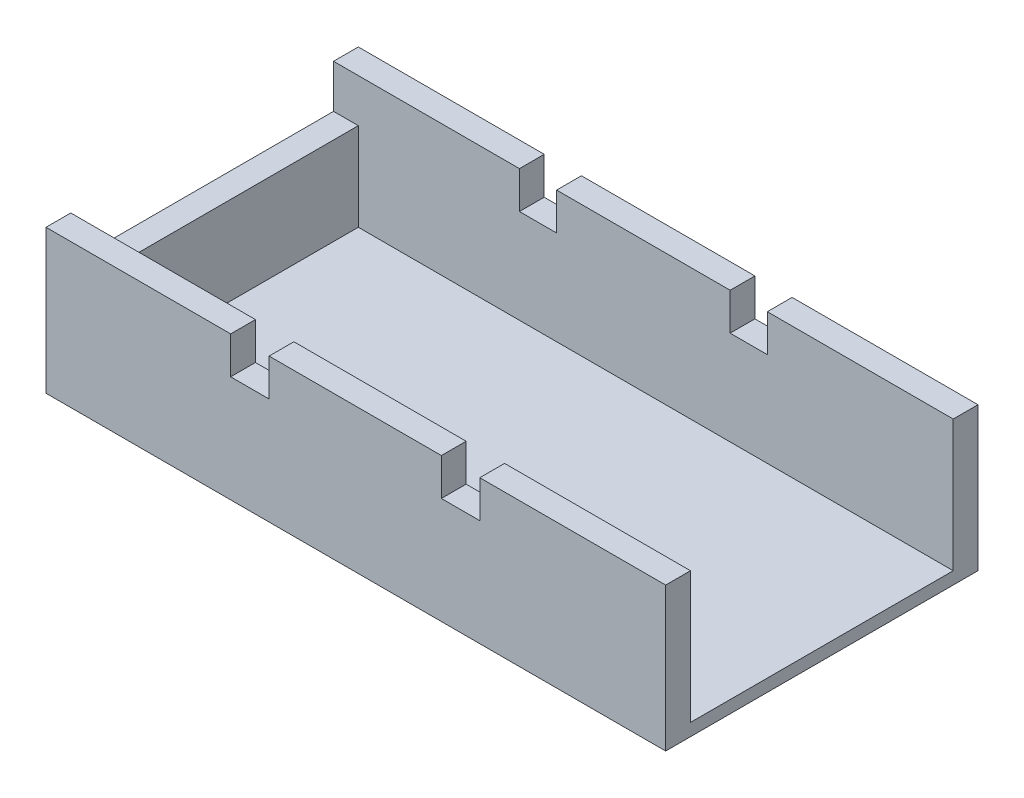
ISO-10303-21;
HEADER;
FILE_DESCRIPTION(('STEP AP214'),'2;1');
FILE_NAME('part.step','',(''),(''),'','','');
FILE_SCHEMA(('AUTOMOTIVE_DESIGN { 1 0 10303 214 1 1 1 1 }'));
ENDSEC;
DATA;
#1=APPLICATION_CONTEXT('core data for automotive mechanical design processes');
#2=APPLICATION_PROTOCOL_DEFINITION('international standard','automotive_design',2000,#1);
#3=PRODUCT_CONTEXT('',#1,'mechanical');
#4=PRODUCT('Part','Part','',(#3));
#5=PRODUCT_RELATED_PRODUCT_CATEGORY('part','',(#4));
#6=PRODUCT_DEFINITION_FORMATION('','',#4);
#7=PRODUCT_DEFINITION_CONTEXT('part definition',#1,'design');
#8=PRODUCT_DEFINITION('design','',#6,#7);
#9=PRODUCT_DEFINITION_SHAPE('','',#8);
#10=(LENGTH_UNIT() NAMED_UNIT(*) SI_UNIT(.MILLI.,.METRE.));
#11=(NAMED_UNIT(*) PLANE_ANGLE_UNIT() SI_UNIT($,.RADIAN.));
#12=(NAMED_UNIT(*) SI_UNIT($,.STERADIAN.) SOLID_ANGLE_UNIT());
#13=UNCERTAINTY_MEASURE_WITH_UNIT(LENGTH_MEASURE(1.E-05),#10,'distance_accuracy_value','');
#14=(GEOMETRIC_REPRESENTATION_CONTEXT(3) GLOBAL_UNCERTAINTY_ASSIGNED_CONTEXT((#13)) GLOBAL_UNIT_ASSIGNED_CONTEXT((#10,
#11,#12)) REPRESENTATION_CONTEXT('',''));
#15=CARTESIAN_POINT('',(0.,0.,0.));
#16=DIRECTION('',(0.,0.,1.));
#17=DIRECTION('',(1.,0.,0.));
#18=AXIS2_PLACEMENT_3D('',#15,#16,#17);
#19=CARTESIAN_POINT('',(-25.,8.6,-10.6));
#20=DIRECTION('',(0.,0.,-1.));
#21=DIRECTION('',(-1.,0.,0.));
#22=AXIS2_PLACEMENT_3D('',#19,#20,#21);
#23=PLANE('',#22);
#24=DIRECTION('',(-1.,0.,0.));
#25=VECTOR('',#24,1.);
#26=CARTESIAN_POINT('',(-23.,8.1,-10.6));
#27=LINE('',#26,#25);
#28=CARTESIAN_POINT('',(-23.,8.1,-10.6));
#29=VERTEX_POINT('',#28);
#30=CARTESIAN_POINT('',(-25.,8.1,-10.6));
#31=VERTEX_POINT('',#30);
#32=EDGE_CURVE('E529',#29,#31,#27,.T.);
#33=ORIENTED_EDGE('',*,*,#32,.F.);
#34=DIRECTION('',(0.,1.,0.));
#35=VECTOR('',#34,1.);
#36=CARTESIAN_POINT('',(-23.,8.6,-10.6));
#37=LINE('',#36,#35);
#38=CARTESIAN_POINT('',(-23.,1.,-10.6));
#39=VERTEX_POINT('',#38);
#40=EDGE_CURVE('E55',#39,#29,#37,.T.);
#41=ORIENTED_EDGE('',*,*,#40,.F.);
#42=DIRECTION('',(1.,0.,0.));
#43=VECTOR('',#42,1.);
#44=CARTESIAN_POINT('',(-25.,1.,-10.6));
#45=LINE('',#44,#43);
#46=CARTESIAN_POINT('',(25.,1.,-10.6));
#47=VERTEX_POINT('',#46);
#48=EDGE_CURVE('E418',#39,#47,#45,.T.);
#49=ORIENTED_EDGE('',*,*,#48,.T.);
#50=DIRECTION('',(0.,-1.,0.));
#51=VECTOR('',#50,1.);
#52=CARTESIAN_POINT('',(25.,8.6,-10.6));
#53=LINE('',#52,#51);
#54=CARTESIAN_POINT('',(25.,11.6,-10.6));
#55=VERTEX_POINT('',#54);
#56=EDGE_CURVE('E427',#55,#47,#53,.T.);
#57=ORIENTED_EDGE('',*,*,#56,.F.);
#58=DIRECTION('',(1.,0.,0.));
#59=VECTOR('',#58,1.);
#60=CARTESIAN_POINT('',(10.,11.6,-10.6));
#61=LINE('',#60,#59);
#62=CARTESIAN_POINT('',(10.,11.6,-10.6));
#63=VERTEX_POINT('',#62);
#64=EDGE_CURVE('E318',#63,#55,#61,.T.);
#65=ORIENTED_EDGE('',*,*,#64,.F.);
#66=DIRECTION('',(0.,-1.,0.));
#67=VECTOR('',#66,1.);
#68=CARTESIAN_POINT('',(10.,11.6,-10.6));
#69=LINE('',#68,#67);
#70=CARTESIAN_POINT('',(10.,8.6,-10.6));
#71=VERTEX_POINT('',#70);
#72=EDGE_CURVE('E326',#63,#71,#69,.T.);
#73=ORIENTED_EDGE('',*,*,#72,.T.);
#74=DIRECTION('',(1.,0.,0.));
#75=VECTOR('',#74,1.);
#76=CARTESIAN_POINT('',(-25.,8.6,-10.6));
#77=LINE('',#76,#75);
#78=CARTESIAN_POINT('',(7.,8.6,-10.6));
#79=VERTEX_POINT('',#78);
#80=EDGE_CURVE('E422',#79,#71,#77,.T.);
#81=ORIENTED_EDGE('',*,*,#80,.F.);
#82=DIRECTION('',(0.,-1.,0.));
#83=VECTOR('',#82,1.);
#84=CARTESIAN_POINT('',(7.,11.6,-10.6));
#85=LINE('',#84,#83);
#86=CARTESIAN_POINT('',(7.,11.6,-10.6));
#87=VERTEX_POINT('',#86);
#88=EDGE_CURVE('E362',#87,#79,#85,.T.);
#89=ORIENTED_EDGE('',*,*,#88,.F.);
#90=DIRECTION('',(1.,0.,0.));
#91=VECTOR('',#90,1.);
#92=CARTESIAN_POINT('',(-7.00000000000001,11.6,-10.6));
#93=LINE('',#92,#91);
#94=CARTESIAN_POINT('',(-7.00000000000001,11.6,-10.6));
#95=VERTEX_POINT('',#94);
#96=EDGE_CURVE('E346',#95,#87,#93,.T.);
#97=ORIENTED_EDGE('',*,*,#96,.F.);
#98=DIRECTION('',(0.,-1.,0.));
#99=VECTOR('',#98,1.);
#100=CARTESIAN_POINT('',(-7.00000000000001,11.6,-10.6));
#101=LINE('',#100,#99);
#102=CARTESIAN_POINT('',(-7.,8.6,-10.6));
#103=VERTEX_POINT('',#102);
#104=EDGE_CURVE('E366',#95,#103,#101,.T.);
#105=ORIENTED_EDGE('',*,*,#104,.T.);
#106=CARTESIAN_POINT('',(-10.,8.6,-10.6));
#107=VERTEX_POINT('',#106);
#108=EDGE_CURVE('E424',#107,#103,#77,.T.);
#109=ORIENTED_EDGE('',*,*,#108,.F.);
#110=DIRECTION('',(0.,-1.,0.));
#111=VECTOR('',#110,1.);
#112=CARTESIAN_POINT('',(-10.,11.6,-10.6));
#113=LINE('',#112,#111);
#114=CARTESIAN_POINT('',(-10.,11.6,-10.6));
#115=VERTEX_POINT('',#114);
#116=EDGE_CURVE('E396',#115,#107,#113,.T.);
#117=ORIENTED_EDGE('',*,*,#116,.F.);
#118=DIRECTION('',(1.,0.,0.));
#119=VECTOR('',#118,1.);
#120=CARTESIAN_POINT('',(-25.,11.6,-10.6));
#121=LINE('',#120,#119);
#122=CARTESIAN_POINT('',(-25.,11.6,-10.6));
#123=VERTEX_POINT('',#122);
#124=EDGE_CURVE('E383',#123,#115,#121,.T.);
#125=ORIENTED_EDGE('',*,*,#124,.F.);
#126=DIRECTION('',(0.,-1.,0.));
#127=VECTOR('',#126,1.);
#128=CARTESIAN_POINT('',(-25.,8.6,-10.6));
#129=LINE('',#128,#127);
#130=EDGE_CURVE('E433',#123,#31,#129,.T.);
#131=ORIENTED_EDGE('',*,*,#130,.T.);
#132=EDGE_LOOP('',(#33,#41,#49,#57,#65,#73,#81,#89,#97,#105,#109,#117,#125,#131));
#133=FACE_BOUND('',#132,.T.);
#134=ADVANCED_FACE('F39',(#133),#23,.F.);
#135=CARTESIAN_POINT('',(25.,8.6,10.6));
#136=DIRECTION('',(0.,0.,1.));
#137=DIRECTION('',(1.,0.,0.));
#138=AXIS2_PLACEMENT_3D('',#135,#136,#137);
#139=PLANE('',#138);
#140=DIRECTION('',(0.,-1.,0.));
#141=VECTOR('',#140,1.);
#142=CARTESIAN_POINT('',(-23.,8.6,10.6));
#143=LINE('',#142,#141);
#144=CARTESIAN_POINT('',(-23.,8.1,10.6));
#145=VERTEX_POINT('',#144);
#146=CARTESIAN_POINT('',(-23.,1.,10.6));
#147=VERTEX_POINT('',#146);
#148=EDGE_CURVE('E11',#145,#147,#143,.T.);
#149=ORIENTED_EDGE('',*,*,#148,.F.);
#150=DIRECTION('',(1.,0.,0.));
#151=VECTOR('',#150,1.);
#152=CARTESIAN_POINT('',(-25.,8.1,10.6));
#153=LINE('',#152,#151);
#154=CARTESIAN_POINT('',(-25.,8.1,10.6));
#155=VERTEX_POINT('',#154);
#156=EDGE_CURVE('E528',#155,#145,#153,.T.);
#157=ORIENTED_EDGE('',*,*,#156,.F.);
#158=DIRECTION('',(0.,-1.,0.));
#159=VECTOR('',#158,1.);
#160=CARTESIAN_POINT('',(-25.,8.6,10.6));
#161=LINE('',#160,#159);
#162=CARTESIAN_POINT('',(-25.,11.6,10.6));
#163=VERTEX_POINT('',#162);
#164=EDGE_CURVE('E414',#163,#155,#161,.T.);
#165=ORIENTED_EDGE('',*,*,#164,.F.);
#166=DIRECTION('',(-1.,0.,0.));
#167=VECTOR('',#166,1.);
#168=CARTESIAN_POINT('',(-25.,11.6,10.6));
#169=LINE('',#168,#167);
#170=CARTESIAN_POINT('',(-10.1,11.6,10.6));
#171=VERTEX_POINT('',#170);
#172=EDGE_CURVE('E295',#171,#163,#169,.T.);
#173=ORIENTED_EDGE('',*,*,#172,.F.);
#174=DIRECTION('',(0.,-1.,0.));
#175=VECTOR('',#174,1.);
#176=CARTESIAN_POINT('',(-10.1,11.6,10.6));
#177=LINE('',#176,#175);
#178=CARTESIAN_POINT('',(-10.1,8.6,10.6));
#179=VERTEX_POINT('',#178);
#180=EDGE_CURVE('E299',#171,#179,#177,.T.);
#181=ORIENTED_EDGE('',*,*,#180,.T.);
#182=DIRECTION('',(-1.,0.,0.));
#183=VECTOR('',#182,1.);
#184=CARTESIAN_POINT('',(25.,8.6,10.6));
#185=LINE('',#184,#183);
#186=CARTESIAN_POINT('',(-7.00000000000001,8.6,10.6));
#187=VERTEX_POINT('',#186);
#188=EDGE_CURVE('E404',#187,#179,#185,.T.);
#189=ORIENTED_EDGE('',*,*,#188,.F.);
#190=DIRECTION('',(0.,-1.,0.));
#191=VECTOR('',#190,1.);
#192=CARTESIAN_POINT('',(-7.00000000000001,11.6,10.6));
#193=LINE('',#192,#191);
#194=CARTESIAN_POINT('',(-7.00000000000001,11.6,10.6));
#195=VERTEX_POINT('',#194);
#196=EDGE_CURVE('E264',#195,#187,#193,.T.);
#197=ORIENTED_EDGE('',*,*,#196,.F.);
#198=DIRECTION('',(-1.,0.,0.));
#199=VECTOR('',#198,1.);
#200=CARTESIAN_POINT('',(6.89999999999999,11.6,10.6));
#201=LINE('',#200,#199);
#202=CARTESIAN_POINT('',(6.89999999999999,11.6,10.6));
#203=VERTEX_POINT('',#202);
#204=EDGE_CURVE('E262',#203,#195,#201,.T.);
#205=ORIENTED_EDGE('',*,*,#204,.F.);
#206=DIRECTION('',(0.,-1.,0.));
#207=VECTOR('',#206,1.);
#208=CARTESIAN_POINT('',(6.89999999999999,11.6,10.6));
#209=LINE('',#208,#207);
#210=CARTESIAN_POINT('',(6.89999999999999,8.6,10.6));
#211=VERTEX_POINT('',#210);
#212=EDGE_CURVE('E272',#203,#211,#209,.T.);
#213=ORIENTED_EDGE('',*,*,#212,.T.);
#214=CARTESIAN_POINT('',(10.,8.6,10.6));
#215=VERTEX_POINT('',#214);
#216=EDGE_CURVE('E400',#215,#211,#185,.T.);
#217=ORIENTED_EDGE('',*,*,#216,.F.);
#218=DIRECTION('',(0.,-1.,0.));
#219=VECTOR('',#218,1.);
#220=CARTESIAN_POINT('',(10.,11.6,10.6));
#221=LINE('',#220,#219);
#222=CARTESIAN_POINT('',(10.,11.6,10.6));
#223=VERTEX_POINT('',#222);
#224=EDGE_CURVE('E242',#223,#215,#221,.T.);
#225=ORIENTED_EDGE('',*,*,#224,.F.);
#226=DIRECTION('',(-1.,0.,0.));
#227=VECTOR('',#226,1.);
#228=CARTESIAN_POINT('',(25.,11.6,10.6));
#229=LINE('',#228,#227);
#230=CARTESIAN_POINT('',(25.,11.6,10.6));
#231=VERTEX_POINT('',#230);
#232=EDGE_CURVE('E231',#231,#223,#229,.T.);
#233=ORIENTED_EDGE('',*,*,#232,.F.);
#234=DIRECTION('',(0.,-1.,0.));
#235=VECTOR('',#234,1.);
#236=CARTESIAN_POINT('',(25.,8.6,10.6));
#237=LINE('',#236,#235);
#238=CARTESIAN_POINT('',(25.,1.,10.6));
#239=VERTEX_POINT('',#238);
#240=EDGE_CURVE('E408',#231,#239,#237,.T.);
#241=ORIENTED_EDGE('',*,*,#240,.T.);
#242=DIRECTION('',(-1.,0.,0.));
#243=VECTOR('',#242,1.);
#244=CARTESIAN_POINT('',(25.,1.,10.6));
#245=LINE('',#244,#243);
#246=EDGE_CURVE('E399',#239,#147,#245,.T.);
#247=ORIENTED_EDGE('',*,*,#246,.T.);
#248=EDGE_LOOP('',(#149,#157,#165,#173,#181,#189,#197,#205,#213,#217,#225,#233,#241,#247));
#249=FACE_BOUND('',#248,.T.);
#250=ADVANCED_FACE('F517',(#249),#139,.F.);
#251=CARTESIAN_POINT('',(0.,1.,0.));
#252=DIRECTION('',(0.,-1.,0.));
#253=DIRECTION('',(0.,0.,-1.));
#254=AXIS2_PLACEMENT_3D('',#251,#252,#253);
#255=PLANE('',#254);
#256=DIRECTION('',(0.,0.,-1.));
#257=VECTOR('',#256,1.);
#258=CARTESIAN_POINT('',(-23.,1.,-12.6));
#259=LINE('',#258,#257);
#260=EDGE_CURVE('E531',#147,#39,#259,.T.);
#261=ORIENTED_EDGE('',*,*,#260,.F.);
#262=ORIENTED_EDGE('',*,*,#246,.F.);
#263=DIRECTION('',(0.,0.,-1.));
#264=VECTOR('',#263,1.);
#265=CARTESIAN_POINT('',(25.,1.,12.6));
#266=LINE('',#265,#264);
#267=EDGE_CURVE('E437',#239,#47,#266,.T.);
#268=ORIENTED_EDGE('',*,*,#267,.T.);
#269=ORIENTED_EDGE('',*,*,#48,.F.);
#270=EDGE_LOOP('',(#261,#262,#268,#269));
#271=FACE_BOUND('',#270,.T.);
#272=ADVANCED_FACE('F573',(#271),#255,.F.);
#273=CARTESIAN_POINT('',(0.,8.6,0.));
#274=DIRECTION('',(0.,1.,0.));
#275=DIRECTION('',(0.,0.,1.));
#276=AXIS2_PLACEMENT_3D('',#273,#274,#275);
#277=PLANE('',#276);
#278=DIRECTION('',(1.,0.,0.));
#279=VECTOR('',#278,1.);
#280=CARTESIAN_POINT('',(-25.,8.6,12.6));
#281=LINE('',#280,#279);
#282=CARTESIAN_POINT('',(6.89999999999999,8.6,12.6));
#283=VERTEX_POINT('',#282);
#284=CARTESIAN_POINT('',(10.,8.6,12.6));
#285=VERTEX_POINT('',#284);
#286=EDGE_CURVE('E403',#283,#285,#281,.T.);
#287=ORIENTED_EDGE('',*,*,#286,.T.);
#288=DIRECTION('',(0.,0.,1.));
#289=VECTOR('',#288,1.);
#290=CARTESIAN_POINT('',(10.,8.6,10.6));
#291=LINE('',#290,#289);
#292=EDGE_CURVE('E236',#215,#285,#291,.T.);
#293=ORIENTED_EDGE('',*,*,#292,.F.);
#294=ORIENTED_EDGE('',*,*,#216,.T.);
#295=DIRECTION('',(0.,0.,-1.));
#296=VECTOR('',#295,1.);
#297=CARTESIAN_POINT('',(6.89999999999999,8.6,12.6));
#298=LINE('',#297,#296);
#299=EDGE_CURVE('E247',#283,#211,#298,.T.);
#300=ORIENTED_EDGE('',*,*,#299,.F.);
#301=EDGE_LOOP('',(#287,#293,#294,#300));
#302=FACE_BOUND('',#301,.T.);
#303=ADVANCED_FACE('F549',(#302),#277,.T.);
#304=CARTESIAN_POINT('',(-10.1,8.6,12.6));
#305=VERTEX_POINT('',#304);
#306=CARTESIAN_POINT('',(-7.,8.6,12.6));
#307=VERTEX_POINT('',#306);
#308=EDGE_CURVE('E405',#305,#307,#281,.T.);
#309=ORIENTED_EDGE('',*,*,#308,.T.);
#310=DIRECTION('',(0.,0.,1.));
#311=VECTOR('',#310,1.);
#312=CARTESIAN_POINT('',(-7.00000000000001,8.6,10.6));
#313=LINE('',#312,#311);
#314=EDGE_CURVE('E241',#187,#307,#313,.T.);
#315=ORIENTED_EDGE('',*,*,#314,.F.);
#316=ORIENTED_EDGE('',*,*,#188,.T.);
#317=DIRECTION('',(0.,0.,-1.));
#318=VECTOR('',#317,1.);
#319=CARTESIAN_POINT('',(-10.1,8.6,10.6));
#320=LINE('',#319,#318);
#321=EDGE_CURVE('E284',#305,#179,#320,.T.);
#322=ORIENTED_EDGE('',*,*,#321,.F.);
#323=EDGE_LOOP('',(#309,#315,#316,#322));
#324=FACE_BOUND('',#323,.T.);
#325=ADVANCED_FACE('F508',(#324),#277,.T.);
#326=CARTESIAN_POINT('',(0.,8.6,0.));
#327=DIRECTION('',(0.,1.,0.));
#328=DIRECTION('',(0.,0.,1.));
#329=AXIS2_PLACEMENT_3D('',#326,#327,#328);
#330=PLANE('',#329);
#331=ORIENTED_EDGE('',*,*,#80,.T.);
#332=DIRECTION('',(0.,0.,1.));
#333=VECTOR('',#332,1.);
#334=CARTESIAN_POINT('',(10.,8.6,-12.6));
#335=LINE('',#334,#333);
#336=CARTESIAN_POINT('',(10.,8.6,-12.6));
#337=VERTEX_POINT('',#336);
#338=EDGE_CURVE('E310',#337,#71,#335,.T.);
#339=ORIENTED_EDGE('',*,*,#338,.F.);
#340=DIRECTION('',(-1.,0.,0.));
#341=VECTOR('',#340,1.);
#342=CARTESIAN_POINT('',(25.,8.6,-12.6));
#343=LINE('',#342,#341);
#344=CARTESIAN_POINT('',(7.,8.6,-12.6));
#345=VERTEX_POINT('',#344);
#346=EDGE_CURVE('E419',#337,#345,#343,.T.);
#347=ORIENTED_EDGE('',*,*,#346,.T.);
#348=DIRECTION('',(0.,0.,-1.));
#349=VECTOR('',#348,1.);
#350=CARTESIAN_POINT('',(7.,8.6,-10.6));
#351=LINE('',#350,#349);
#352=EDGE_CURVE('E343',#79,#345,#351,.T.);
#353=ORIENTED_EDGE('',*,*,#352,.F.);
#354=EDGE_LOOP('',(#331,#339,#347,#353));
#355=FACE_BOUND('',#354,.T.);
#356=ADVANCED_FACE('F592',(#355),#330,.T.);
#357=ORIENTED_EDGE('',*,*,#108,.T.);
#358=DIRECTION('',(0.,0.,1.));
#359=VECTOR('',#358,1.);
#360=CARTESIAN_POINT('',(-7.,8.6,-12.6));
#361=LINE('',#360,#359);
#362=CARTESIAN_POINT('',(-7.,8.6,-12.6));
#363=VERTEX_POINT('',#362);
#364=EDGE_CURVE('E337',#363,#103,#361,.T.);
#365=ORIENTED_EDGE('',*,*,#364,.F.);
#366=CARTESIAN_POINT('',(-10.,8.6,-12.6));
#367=VERTEX_POINT('',#366);
#368=EDGE_CURVE('E423',#363,#367,#343,.T.);
#369=ORIENTED_EDGE('',*,*,#368,.T.);
#370=DIRECTION('',(0.,0.,-1.));
#371=VECTOR('',#370,1.);
#372=CARTESIAN_POINT('',(-10.,8.6,-10.6));
#373=LINE('',#372,#371);
#374=EDGE_CURVE('E374',#107,#367,#373,.T.);
#375=ORIENTED_EDGE('',*,*,#374,.F.);
#376=EDGE_LOOP('',(#357,#365,#369,#375));
#377=FACE_BOUND('',#376,.T.);
#378=ADVANCED_FACE('F493',(#377),#330,.T.);
#379=CARTESIAN_POINT('',(25.,1.,12.6));
#380=DIRECTION('',(-1.,0.,0.));
#381=DIRECTION('',(0.,0.,1.));
#382=AXIS2_PLACEMENT_3D('',#379,#380,#381);
#383=PLANE('',#382);
#384=DIRECTION('',(0.,0.,-1.));
#385=VECTOR('',#384,1.);
#386=CARTESIAN_POINT('',(25.,0.,12.6));
#387=LINE('',#386,#385);
#388=CARTESIAN_POINT('',(25.,0.,12.6));
#389=VERTEX_POINT('',#388);
#390=CARTESIAN_POINT('',(25.,0.,-12.6));
#391=VERTEX_POINT('',#390);
#392=EDGE_CURVE('E436',#389,#391,#387,.T.);
#393=ORIENTED_EDGE('',*,*,#392,.T.);
#394=DIRECTION('',(0.,-1.,0.));
#395=VECTOR('',#394,1.);
#396=CARTESIAN_POINT('',(25.,1.,-12.6));
#397=LINE('',#396,#395);
#398=CARTESIAN_POINT('',(25.,11.6,-12.6));
#399=VERTEX_POINT('',#398);
#400=EDGE_CURVE('E48',#399,#391,#397,.T.);
#401=ORIENTED_EDGE('',*,*,#400,.F.);
#402=DIRECTION('',(0.,0.,-1.));
#403=VECTOR('',#402,1.);
#404=CARTESIAN_POINT('',(25.,11.6,-10.6));
#405=LINE('',#404,#403);
#406=EDGE_CURVE('E322',#55,#399,#405,.T.);
#407=ORIENTED_EDGE('',*,*,#406,.F.);
#408=ORIENTED_EDGE('',*,*,#56,.T.);
#409=ORIENTED_EDGE('',*,*,#267,.F.);
#410=ORIENTED_EDGE('',*,*,#240,.F.);
#411=DIRECTION('',(0.,0.,-1.));
#412=VECTOR('',#411,1.);
#413=CARTESIAN_POINT('',(25.,11.6,12.6));
#414=LINE('',#413,#412);
#415=CARTESIAN_POINT('',(25.,11.6,12.6));
#416=VERTEX_POINT('',#415);
#417=EDGE_CURVE('E225',#416,#231,#414,.T.);
#418=ORIENTED_EDGE('',*,*,#417,.F.);
#419=DIRECTION('',(0.,-1.,0.));
#420=VECTOR('',#419,1.);
#421=CARTESIAN_POINT('',(25.,1.,12.6));
#422=LINE('',#421,#420);
#423=EDGE_CURVE('E220',#416,#389,#422,.T.);
#424=ORIENTED_EDGE('',*,*,#423,.T.);
#425=EDGE_LOOP('',(#393,#401,#407,#408,#409,#410,#418,#424));
#426=FACE_BOUND('',#425,.T.);
#427=ADVANCED_FACE('F41',(#426),#383,.F.);
#428=CARTESIAN_POINT('',(-25.,1.,-12.6));
#429=DIRECTION('',(0.,0.,1.));
#430=DIRECTION('',(1.,0.,0.));
#431=AXIS2_PLACEMENT_3D('',#428,#429,#430);
#432=PLANE('',#431);
#433=DIRECTION('',(-1.,0.,0.));
#434=VECTOR('',#433,1.);
#435=CARTESIAN_POINT('',(-25.,0.,-12.6));
#436=LINE('',#435,#434);
#437=CARTESIAN_POINT('',(-25.,0.,-12.6));
#438=VERTEX_POINT('',#437);
#439=EDGE_CURVE('E445',#391,#438,#436,.T.);
#440=ORIENTED_EDGE('',*,*,#439,.T.);
#441=DIRECTION('',(0.,-1.,0.));
#442=VECTOR('',#441,1.);
#443=CARTESIAN_POINT('',(-25.,1.,-12.6));
#444=LINE('',#443,#442);
#445=CARTESIAN_POINT('',(-25.,11.6,-12.6));
#446=VERTEX_POINT('',#445);
#447=EDGE_CURVE('E460',#446,#438,#444,.T.);
#448=ORIENTED_EDGE('',*,*,#447,.F.);
#449=DIRECTION('',(-1.,0.,0.));
#450=VECTOR('',#449,1.);
#451=CARTESIAN_POINT('',(-10.,11.6,-12.6));
#452=LINE('',#451,#450);
#453=CARTESIAN_POINT('',(-10.,11.6,-12.6));
#454=VERTEX_POINT('',#453);
#455=EDGE_CURVE('E375',#454,#446,#452,.T.);
#456=ORIENTED_EDGE('',*,*,#455,.F.);
#457=DIRECTION('',(0.,-1.,0.));
#458=VECTOR('',#457,1.);
#459=CARTESIAN_POINT('',(-10.,11.6,-12.6));
#460=LINE('',#459,#458);
#461=EDGE_CURVE('E389',#454,#367,#460,.T.);
#462=ORIENTED_EDGE('',*,*,#461,.T.);
#463=ORIENTED_EDGE('',*,*,#368,.F.);
#464=DIRECTION('',(0.,-1.,0.));
#465=VECTOR('',#464,1.);
#466=CARTESIAN_POINT('',(-7.,11.6,-12.6));
#467=LINE('',#466,#465);
#468=CARTESIAN_POINT('',(-7.,11.6,-12.6));
#469=VERTEX_POINT('',#468);
#470=EDGE_CURVE('E370',#469,#363,#467,.T.);
#471=ORIENTED_EDGE('',*,*,#470,.F.);
#472=DIRECTION('',(-1.,0.,0.));
#473=VECTOR('',#472,1.);
#474=CARTESIAN_POINT('',(7.,11.6,-12.6));
#475=LINE('',#474,#473);
#476=CARTESIAN_POINT('',(7.,11.6,-12.6));
#477=VERTEX_POINT('',#476);
#478=EDGE_CURVE('E338',#477,#469,#475,.T.);
#479=ORIENTED_EDGE('',*,*,#478,.F.);
#480=DIRECTION('',(0.,-1.,0.));
#481=VECTOR('',#480,1.);
#482=CARTESIAN_POINT('',(7.,11.6,-12.6));
#483=LINE('',#482,#481);
#484=EDGE_CURVE('E352',#477,#345,#483,.T.);
#485=ORIENTED_EDGE('',*,*,#484,.T.);
#486=ORIENTED_EDGE('',*,*,#346,.F.);
#487=DIRECTION('',(0.,-1.,0.));
#488=VECTOR('',#487,1.);
#489=CARTESIAN_POINT('',(10.,11.6,-12.6));
#490=LINE('',#489,#488);
#491=CARTESIAN_POINT('',(10.,11.6,-12.6));
#492=VERTEX_POINT('',#491);
#493=EDGE_CURVE('E333',#492,#337,#490,.T.);
#494=ORIENTED_EDGE('',*,*,#493,.F.);
#495=DIRECTION('',(-1.,0.,0.));
#496=VECTOR('',#495,1.);
#497=CARTESIAN_POINT('',(25.,11.6,-12.6));
#498=LINE('',#497,#496);
#499=EDGE_CURVE('E311',#399,#492,#498,.T.);
#500=ORIENTED_EDGE('',*,*,#499,.F.);
#501=ORIENTED_EDGE('',*,*,#400,.T.);
#502=EDGE_LOOP('',(#440,#448,#456,#462,#463,#471,#479,#485,#486,#494,#500,#501));
#503=FACE_BOUND('',#502,.T.);
#504=ADVANCED_FACE('F466',(#503),#432,.F.);
#505=CARTESIAN_POINT('',(-25.,1.,12.6));
#506=DIRECTION('',(1.,0.,0.));
#507=DIRECTION('',(0.,0.,-1.));
#508=AXIS2_PLACEMENT_3D('',#505,#506,#507);
#509=PLANE('',#508);
#510=DIRECTION('',(0.,0.,1.));
#511=VECTOR('',#510,1.);
#512=CARTESIAN_POINT('',(-25.,0.,12.6));
#513=LINE('',#512,#511);
#514=CARTESIAN_POINT('',(-25.,0.,12.6));
#515=VERTEX_POINT('',#514);
#516=EDGE_CURVE('E449',#438,#515,#513,.T.);
#517=ORIENTED_EDGE('',*,*,#516,.T.);
#518=DIRECTION('',(0.,-1.,0.));
#519=VECTOR('',#518,1.);
#520=CARTESIAN_POINT('',(-25.,1.,12.6));
#521=LINE('',#520,#519);
#522=CARTESIAN_POINT('',(-25.,11.6,12.6));
#523=VERTEX_POINT('',#522);
#524=EDGE_CURVE('E457',#523,#515,#521,.T.);
#525=ORIENTED_EDGE('',*,*,#524,.F.);
#526=DIRECTION('',(0.,0.,1.));
#527=VECTOR('',#526,1.);
#528=CARTESIAN_POINT('',(-25.,11.6,10.6));
#529=LINE('',#528,#527);
#530=EDGE_CURVE('E285',#163,#523,#529,.T.);
#531=ORIENTED_EDGE('',*,*,#530,.F.);
#532=ORIENTED_EDGE('',*,*,#164,.T.);
#533=DIRECTION('',(0.,0.,1.));
#534=VECTOR('',#533,1.);
#535=CARTESIAN_POINT('',(-25.,8.1,-10.6));
#536=LINE('',#535,#534);
#537=EDGE_CURVE('E522',#31,#155,#536,.T.);
#538=ORIENTED_EDGE('',*,*,#537,.F.);
#539=ORIENTED_EDGE('',*,*,#130,.F.);
#540=DIRECTION('',(0.,0.,1.));
#541=VECTOR('',#540,1.);
#542=CARTESIAN_POINT('',(-25.,11.6,-12.6));
#543=LINE('',#542,#541);
#544=EDGE_CURVE('E379',#446,#123,#543,.T.);
#545=ORIENTED_EDGE('',*,*,#544,.F.);
#546=ORIENTED_EDGE('',*,*,#447,.T.);
#547=EDGE_LOOP('',(#517,#525,#531,#532,#538,#539,#545,#546));
#548=FACE_BOUND('',#547,.T.);
#549=ADVANCED_FACE('F476',(#548),#509,.F.);
#550=CARTESIAN_POINT('',(-25.,1.,12.6));
#551=DIRECTION('',(0.,0.,-1.));
#552=DIRECTION('',(-1.,0.,0.));
#553=AXIS2_PLACEMENT_3D('',#550,#551,#552);
#554=PLANE('',#553);
#555=ORIENTED_EDGE('',*,*,#524,.T.);
#556=DIRECTION('',(1.,0.,0.));
#557=VECTOR('',#556,1.);
#558=CARTESIAN_POINT('',(-25.,0.,12.6));
#559=LINE('',#558,#557);
#560=EDGE_CURVE('E441',#515,#389,#559,.T.);
#561=ORIENTED_EDGE('',*,*,#560,.T.);
#562=ORIENTED_EDGE('',*,*,#423,.F.);
#563=DIRECTION('',(1.,0.,0.));
#564=VECTOR('',#563,1.);
#565=CARTESIAN_POINT('',(10.,11.6,12.6));
#566=LINE('',#565,#564);
#567=CARTESIAN_POINT('',(10.,11.6,12.6));
#568=VERTEX_POINT('',#567);
#569=EDGE_CURVE('E212',#568,#416,#566,.T.);
#570=ORIENTED_EDGE('',*,*,#569,.F.);
#571=DIRECTION('',(0.,-1.,0.));
#572=VECTOR('',#571,1.);
#573=CARTESIAN_POINT('',(10.,11.6,12.6));
#574=LINE('',#573,#572);
#575=EDGE_CURVE('E217',#568,#285,#574,.T.);
#576=ORIENTED_EDGE('',*,*,#575,.T.);
#577=ORIENTED_EDGE('',*,*,#286,.F.);
#578=DIRECTION('',(0.,-1.,0.));
#579=VECTOR('',#578,1.);
#580=CARTESIAN_POINT('',(6.89999999999999,11.6,12.6));
#581=LINE('',#580,#579);
#582=CARTESIAN_POINT('',(6.89999999999999,11.6,12.6));
#583=VERTEX_POINT('',#582);
#584=EDGE_CURVE('E276',#583,#283,#581,.T.);
#585=ORIENTED_EDGE('',*,*,#584,.F.);
#586=DIRECTION('',(1.,0.,0.));
#587=VECTOR('',#586,1.);
#588=CARTESIAN_POINT('',(-7.00000000000001,11.6,12.6));
#589=LINE('',#588,#587);
#590=CARTESIAN_POINT('',(-7.00000000000001,11.6,12.6));
#591=VERTEX_POINT('',#590);
#592=EDGE_CURVE('E256',#591,#583,#589,.T.);
#593=ORIENTED_EDGE('',*,*,#592,.F.);
#594=DIRECTION('',(0.,-1.,0.));
#595=VECTOR('',#594,1.);
#596=CARTESIAN_POINT('',(-7.00000000000001,11.6,12.6));
#597=LINE('',#596,#595);
#598=EDGE_CURVE('E280',#591,#307,#597,.T.);
#599=ORIENTED_EDGE('',*,*,#598,.T.);
#600=ORIENTED_EDGE('',*,*,#308,.F.);
#601=DIRECTION('',(0.,-1.,0.));
#602=VECTOR('',#601,1.);
#603=CARTESIAN_POINT('',(-10.1,11.6,12.6));
#604=LINE('',#603,#602);
#605=CARTESIAN_POINT('',(-10.1,11.6,12.6));
#606=VERTEX_POINT('',#605);
#607=EDGE_CURVE('E306',#606,#305,#604,.T.);
#608=ORIENTED_EDGE('',*,*,#607,.F.);
#609=DIRECTION('',(1.,0.,0.));
#610=VECTOR('',#609,1.);
#611=CARTESIAN_POINT('',(-10.1,11.6,12.6));
#612=LINE('',#611,#610);
#613=EDGE_CURVE('E289',#523,#606,#612,.T.);
#614=ORIENTED_EDGE('',*,*,#613,.F.);
#615=EDGE_LOOP('',(#555,#561,#562,#570,#576,#577,#585,#593,#599,#600,#608,#614));
#616=FACE_BOUND('',#615,.T.);
#617=ADVANCED_FACE('F214',(#616),#554,.F.);
#618=CARTESIAN_POINT('',(0.,0.,0.));
#619=DIRECTION('',(0.,-1.,0.));
#620=DIRECTION('',(0.,0.,-1.));
#621=AXIS2_PLACEMENT_3D('',#618,#619,#620);
#622=PLANE('',#621);
#623=ORIENTED_EDGE('',*,*,#392,.F.);
#624=ORIENTED_EDGE('',*,*,#560,.F.);
#625=ORIENTED_EDGE('',*,*,#516,.F.);
#626=ORIENTED_EDGE('',*,*,#439,.F.);
#627=EDGE_LOOP('',(#623,#624,#625,#626));
#628=FACE_BOUND('',#627,.T.);
#629=ADVANCED_FACE('F474',(#628),#622,.T.);
#630=CARTESIAN_POINT('',(-10.,11.6,-10.6));
#631=DIRECTION('',(-1.,0.,0.));
#632=DIRECTION('',(0.,0.,1.));
#633=AXIS2_PLACEMENT_3D('',#630,#631,#632);
#634=PLANE('',#633);
#635=ORIENTED_EDGE('',*,*,#374,.T.);
#636=ORIENTED_EDGE('',*,*,#461,.F.);
#637=DIRECTION('',(0.,0.,-1.));
#638=VECTOR('',#637,1.);
#639=CARTESIAN_POINT('',(-10.,11.6,-10.6));
#640=LINE('',#639,#638);
#641=EDGE_CURVE('E386',#115,#454,#640,.T.);
#642=ORIENTED_EDGE('',*,*,#641,.F.);
#643=ORIENTED_EDGE('',*,*,#116,.T.);
#644=EDGE_LOOP('',(#635,#636,#642,#643));
#645=FACE_BOUND('',#644,.T.);
#646=ADVANCED_FACE('F489',(#645),#634,.F.);
#647=CARTESIAN_POINT('',(0.,11.6,0.));
#648=DIRECTION('',(0.,1.,0.));
#649=DIRECTION('',(0.,0.,1.));
#650=AXIS2_PLACEMENT_3D('',#647,#648,#649);
#651=PLANE('',#650);
#652=ORIENTED_EDGE('',*,*,#455,.T.);
#653=ORIENTED_EDGE('',*,*,#544,.T.);
#654=ORIENTED_EDGE('',*,*,#124,.T.);
#655=ORIENTED_EDGE('',*,*,#641,.T.);
#656=EDGE_LOOP('',(#652,#653,#654,#655));
#657=FACE_BOUND('',#656,.T.);
#658=ADVANCED_FACE('F484',(#657),#651,.T.);
#659=CARTESIAN_POINT('',(-7.,11.6,-12.6));
#660=DIRECTION('',(1.,0.,0.));
#661=DIRECTION('',(0.,0.,-1.));
#662=AXIS2_PLACEMENT_3D('',#659,#660,#661);
#663=PLANE('',#662);
#664=ORIENTED_EDGE('',*,*,#364,.T.);
#665=ORIENTED_EDGE('',*,*,#104,.F.);
#666=DIRECTION('',(0.,0.,1.));
#667=VECTOR('',#666,1.);
#668=CARTESIAN_POINT('',(-7.,11.6,-12.6));
#669=LINE('',#668,#667);
#670=EDGE_CURVE('E342',#469,#95,#669,.T.);
#671=ORIENTED_EDGE('',*,*,#670,.F.);
#672=ORIENTED_EDGE('',*,*,#470,.T.);
#673=EDGE_LOOP('',(#664,#665,#671,#672));
#674=FACE_BOUND('',#673,.T.);
#675=ADVANCED_FACE('F499',(#674),#663,.F.);
#676=CARTESIAN_POINT('',(7.,11.6,-10.6));
#677=DIRECTION('',(-1.,0.,0.));
#678=DIRECTION('',(0.,0.,1.));
#679=AXIS2_PLACEMENT_3D('',#676,#677,#678);
#680=PLANE('',#679);
#681=ORIENTED_EDGE('',*,*,#352,.T.);
#682=ORIENTED_EDGE('',*,*,#484,.F.);
#683=DIRECTION('',(0.,0.,-1.));
#684=VECTOR('',#683,1.);
#685=CARTESIAN_POINT('',(7.,11.6,-10.6));
#686=LINE('',#685,#684);
#687=EDGE_CURVE('E349',#87,#477,#686,.T.);
#688=ORIENTED_EDGE('',*,*,#687,.F.);
#689=ORIENTED_EDGE('',*,*,#88,.T.);
#690=EDGE_LOOP('',(#681,#682,#688,#689));
#691=FACE_BOUND('',#690,.T.);
#692=ADVANCED_FACE('F789',(#691),#680,.F.);
#693=CARTESIAN_POINT('',(0.,11.6,0.));
#694=DIRECTION('',(0.,1.,0.));
#695=DIRECTION('',(0.,0.,1.));
#696=AXIS2_PLACEMENT_3D('',#693,#694,#695);
#697=PLANE('',#696);
#698=ORIENTED_EDGE('',*,*,#478,.T.);
#699=ORIENTED_EDGE('',*,*,#670,.T.);
#700=ORIENTED_EDGE('',*,*,#96,.T.);
#701=ORIENTED_EDGE('',*,*,#687,.T.);
#702=EDGE_LOOP('',(#698,#699,#700,#701));
#703=FACE_BOUND('',#702,.T.);
#704=ADVANCED_FACE('F796',(#703),#697,.T.);
#705=CARTESIAN_POINT('',(10.,11.6,-12.6));
#706=DIRECTION('',(1.,0.,0.));
#707=DIRECTION('',(0.,0.,-1.));
#708=AXIS2_PLACEMENT_3D('',#705,#706,#707);
#709=PLANE('',#708);
#710=ORIENTED_EDGE('',*,*,#338,.T.);
#711=ORIENTED_EDGE('',*,*,#72,.F.);
#712=DIRECTION('',(0.,0.,1.));
#713=VECTOR('',#712,1.);
#714=CARTESIAN_POINT('',(10.,11.6,-12.6));
#715=LINE('',#714,#713);
#716=EDGE_CURVE('E315',#492,#63,#715,.T.);
#717=ORIENTED_EDGE('',*,*,#716,.F.);
#718=ORIENTED_EDGE('',*,*,#493,.T.);
#719=EDGE_LOOP('',(#710,#711,#717,#718));
#720=FACE_BOUND('',#719,.T.);
#721=ADVANCED_FACE('F605',(#720),#709,.F.);
#722=CARTESIAN_POINT('',(0.,11.6,0.));
#723=DIRECTION('',(0.,1.,0.));
#724=DIRECTION('',(0.,0.,1.));
#725=AXIS2_PLACEMENT_3D('',#722,#723,#724);
#726=PLANE('',#725);
#727=ORIENTED_EDGE('',*,*,#499,.T.);
#728=ORIENTED_EDGE('',*,*,#716,.T.);
#729=ORIENTED_EDGE('',*,*,#64,.T.);
#730=ORIENTED_EDGE('',*,*,#406,.T.);
#731=EDGE_LOOP('',(#727,#728,#729,#730));
#732=FACE_BOUND('',#731,.T.);
#733=ADVANCED_FACE('F608',(#732),#726,.T.);
#734=CARTESIAN_POINT('',(-10.1,11.6,10.6));
#735=DIRECTION('',(-1.,0.,0.));
#736=DIRECTION('',(0.,0.,1.));
#737=AXIS2_PLACEMENT_3D('',#734,#735,#736);
#738=PLANE('',#737);
#739=ORIENTED_EDGE('',*,*,#321,.T.);
#740=ORIENTED_EDGE('',*,*,#180,.F.);
#741=DIRECTION('',(0.,0.,-1.));
#742=VECTOR('',#741,1.);
#743=CARTESIAN_POINT('',(-10.1,11.6,10.6));
#744=LINE('',#743,#742);
#745=EDGE_CURVE('E292',#606,#171,#744,.T.);
#746=ORIENTED_EDGE('',*,*,#745,.F.);
#747=ORIENTED_EDGE('',*,*,#607,.T.);
#748=EDGE_LOOP('',(#739,#740,#746,#747));
#749=FACE_BOUND('',#748,.T.);
#750=ADVANCED_FACE('F513',(#749),#738,.F.);
#751=CARTESIAN_POINT('',(0.,11.6,0.));
#752=DIRECTION('',(0.,-1.,0.));
#753=DIRECTION('',(0.,0.,-1.));
#754=AXIS2_PLACEMENT_3D('',#751,#752,#753);
#755=PLANE('',#754);
#756=ORIENTED_EDGE('',*,*,#530,.T.);
#757=ORIENTED_EDGE('',*,*,#613,.T.);
#758=ORIENTED_EDGE('',*,*,#745,.T.);
#759=ORIENTED_EDGE('',*,*,#172,.T.);
#760=EDGE_LOOP('',(#756,#757,#758,#759));
#761=FACE_BOUND('',#760,.T.);
#762=ADVANCED_FACE('F519',(#761),#755,.F.);
#763=CARTESIAN_POINT('',(-7.00000000000001,11.6,10.6));
#764=DIRECTION('',(1.,0.,0.));
#765=DIRECTION('',(0.,0.,-1.));
#766=AXIS2_PLACEMENT_3D('',#763,#764,#765);
#767=PLANE('',#766);
#768=ORIENTED_EDGE('',*,*,#314,.T.);
#769=ORIENTED_EDGE('',*,*,#598,.F.);
#770=DIRECTION('',(0.,0.,1.));
#771=VECTOR('',#770,1.);
#772=CARTESIAN_POINT('',(-7.00000000000001,11.6,10.6));
#773=LINE('',#772,#771);
#774=EDGE_CURVE('E252',#195,#591,#773,.T.);
#775=ORIENTED_EDGE('',*,*,#774,.F.);
#776=ORIENTED_EDGE('',*,*,#196,.T.);
#777=EDGE_LOOP('',(#768,#769,#775,#776));
#778=FACE_BOUND('',#777,.T.);
#779=ADVANCED_FACE('F559',(#778),#767,.F.);
#780=CARTESIAN_POINT('',(6.89999999999999,11.6,12.6));
#781=DIRECTION('',(-1.,0.,0.));
#782=DIRECTION('',(0.,0.,1.));
#783=AXIS2_PLACEMENT_3D('',#780,#781,#782);
#784=PLANE('',#783);
#785=ORIENTED_EDGE('',*,*,#299,.T.);
#786=ORIENTED_EDGE('',*,*,#212,.F.);
#787=DIRECTION('',(0.,0.,-1.));
#788=VECTOR('',#787,1.);
#789=CARTESIAN_POINT('',(6.89999999999999,11.6,12.6));
#790=LINE('',#789,#788);
#791=EDGE_CURVE('E259',#583,#203,#790,.T.);
#792=ORIENTED_EDGE('',*,*,#791,.F.);
#793=ORIENTED_EDGE('',*,*,#584,.T.);
#794=EDGE_LOOP('',(#785,#786,#792,#793));
#795=FACE_BOUND('',#794,.T.);
#796=ADVANCED_FACE('F553',(#795),#784,.F.);
#797=CARTESIAN_POINT('',(0.,11.6,0.));
#798=DIRECTION('',(0.,1.,0.));
#799=DIRECTION('',(0.,0.,1.));
#800=AXIS2_PLACEMENT_3D('',#797,#798,#799);
#801=PLANE('',#800);
#802=ORIENTED_EDGE('',*,*,#774,.T.);
#803=ORIENTED_EDGE('',*,*,#592,.T.);
#804=ORIENTED_EDGE('',*,*,#791,.T.);
#805=ORIENTED_EDGE('',*,*,#204,.T.);
#806=EDGE_LOOP('',(#802,#803,#804,#805));
#807=FACE_BOUND('',#806,.T.);
#808=ADVANCED_FACE('F555',(#807),#801,.T.);
#809=CARTESIAN_POINT('',(10.,11.6,10.6));
#810=DIRECTION('',(1.,0.,0.));
#811=DIRECTION('',(0.,0.,-1.));
#812=AXIS2_PLACEMENT_3D('',#809,#810,#811);
#813=PLANE('',#812);
#814=ORIENTED_EDGE('',*,*,#292,.T.);
#815=ORIENTED_EDGE('',*,*,#575,.F.);
#816=DIRECTION('',(0.,0.,1.));
#817=VECTOR('',#816,1.);
#818=CARTESIAN_POINT('',(10.,11.6,10.6));
#819=LINE('',#818,#817);
#820=EDGE_CURVE('E226',#223,#568,#819,.T.);
#821=ORIENTED_EDGE('',*,*,#820,.F.);
#822=ORIENTED_EDGE('',*,*,#224,.T.);
#823=EDGE_LOOP('',(#814,#815,#821,#822));
#824=FACE_BOUND('',#823,.T.);
#825=ADVANCED_FACE('F238',(#824),#813,.F.);
#826=CARTESIAN_POINT('',(0.,11.6,0.));
#827=DIRECTION('',(0.,1.,0.));
#828=DIRECTION('',(0.,0.,1.));
#829=AXIS2_PLACEMENT_3D('',#826,#827,#828);
#830=PLANE('',#829);
#831=ORIENTED_EDGE('',*,*,#820,.T.);
#832=ORIENTED_EDGE('',*,*,#569,.T.);
#833=ORIENTED_EDGE('',*,*,#417,.T.);
#834=ORIENTED_EDGE('',*,*,#232,.T.);
#835=EDGE_LOOP('',(#831,#832,#833,#834));
#836=FACE_BOUND('',#835,.T.);
#837=ADVANCED_FACE('F229',(#836),#830,.T.);
#838=CARTESIAN_POINT('',(-23.,4.6,-12.6));
#839=DIRECTION('',(-1.,0.,0.));
#840=DIRECTION('',(0.,0.,1.));
#841=AXIS2_PLACEMENT_3D('',#838,#839,#840);
#842=PLANE('',#841);
#843=ORIENTED_EDGE('',*,*,#260,.T.);
#844=ORIENTED_EDGE('',*,*,#40,.T.);
#845=DIRECTION('',(0.,0.,-1.));
#846=VECTOR('',#845,1.);
#847=CARTESIAN_POINT('',(-23.,8.1,10.6));
#848=LINE('',#847,#846);
#849=EDGE_CURVE('E536',#145,#29,#848,.T.);
#850=ORIENTED_EDGE('',*,*,#849,.F.);
#851=ORIENTED_EDGE('',*,*,#148,.T.);
#852=EDGE_LOOP('',(#843,#844,#850,#851));
#853=FACE_BOUND('',#852,.T.);
#854=ADVANCED_FACE('F611',(#853),#842,.F.);
#855=CARTESIAN_POINT('',(0.,8.1,0.));
#856=DIRECTION('',(0.,1.,0.));
#857=DIRECTION('',(0.,0.,1.));
#858=AXIS2_PLACEMENT_3D('',#855,#856,#857);
#859=PLANE('',#858);
#860=ORIENTED_EDGE('',*,*,#156,.T.);
#861=ORIENTED_EDGE('',*,*,#849,.T.);
#862=ORIENTED_EDGE('',*,*,#32,.T.);
#863=ORIENTED_EDGE('',*,*,#537,.T.);
#864=EDGE_LOOP('',(#860,#861,#862,#863));
#865=FACE_BOUND('',#864,.T.);
#866=ADVANCED_FACE('F526',(#865),#859,.T.);
#867=CLOSED_SHELL('',(#134,#250,#272,#303,#325,#356,#378,#427,#504,#549,#617,#629,#646,#658,
#675,#692,#704,#721,#733,#750,#762,#779,#796,#808,#825,#837,#854,#866));
#868=MANIFOLD_SOLID_BREP('B2',#867);
#869=ADVANCED_BREP_SHAPE_REPRESENTATION('',(#18,#868),#14);
#870=SHAPE_DEFINITION_REPRESENTATION(#9,#869);
ENDSEC;
END-ISO-10303-21;
